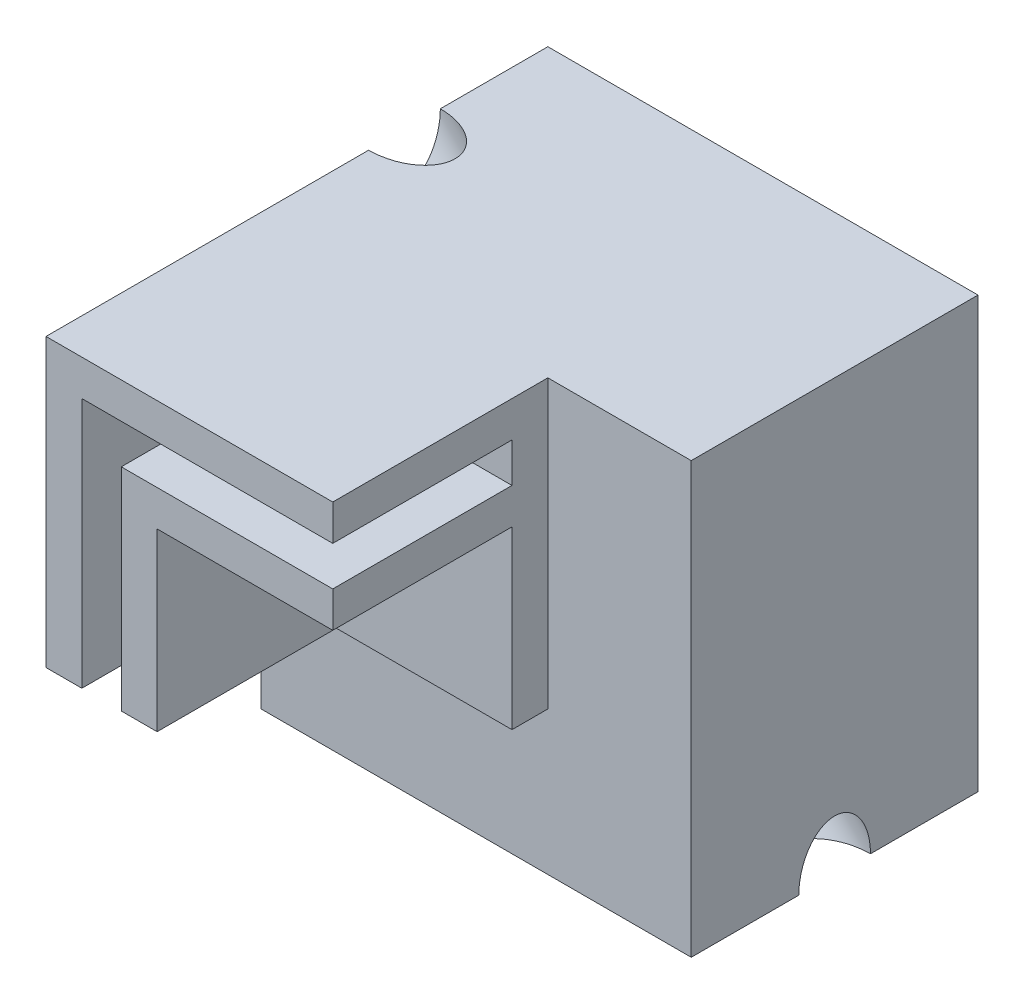
ISO-10303-21;
HEADER;
FILE_DESCRIPTION(('STEP AP214'),'2;1');
FILE_NAME('part.step','',(''),(''),'','','');
FILE_SCHEMA(('AUTOMOTIVE_DESIGN { 1 0 10303 214 1 1 1 1 }'));
ENDSEC;
DATA;
#1=APPLICATION_CONTEXT('core data for automotive mechanical design processes');
#2=APPLICATION_PROTOCOL_DEFINITION('international standard','automotive_design',2000,#1);
#3=PRODUCT_CONTEXT('',#1,'mechanical');
#4=PRODUCT('Part','Part','',(#3));
#5=PRODUCT_RELATED_PRODUCT_CATEGORY('part','',(#4));
#6=PRODUCT_DEFINITION_FORMATION('','',#4);
#7=PRODUCT_DEFINITION_CONTEXT('part definition',#1,'design');
#8=PRODUCT_DEFINITION('design','',#6,#7);
#9=PRODUCT_DEFINITION_SHAPE('','',#8);
#10=(LENGTH_UNIT() NAMED_UNIT(*) SI_UNIT(.MILLI.,.METRE.));
#11=(NAMED_UNIT(*) PLANE_ANGLE_UNIT() SI_UNIT($,.RADIAN.));
#12=(NAMED_UNIT(*) SI_UNIT($,.STERADIAN.) SOLID_ANGLE_UNIT());
#13=UNCERTAINTY_MEASURE_WITH_UNIT(LENGTH_MEASURE(1.E-05),#10,'distance_accuracy_value','');
#14=(GEOMETRIC_REPRESENTATION_CONTEXT(3) GLOBAL_UNCERTAINTY_ASSIGNED_CONTEXT((#13)) GLOBAL_UNIT_ASSIGNED_CONTEXT((#10,
#11,#12)) REPRESENTATION_CONTEXT('',''));
#15=CARTESIAN_POINT('',(0.,0.,0.));
#16=DIRECTION('',(0.,0.,1.));
#17=DIRECTION('',(1.,0.,0.));
#18=AXIS2_PLACEMENT_3D('',#15,#16,#17);
#19=CARTESIAN_POINT('',(0.,0.,30.));
#20=DIRECTION('',(0.,0.,1.));
#21=DIRECTION('',(1.,0.,0.));
#22=AXIS2_PLACEMENT_3D('',#19,#20,#21);
#23=PLANE('',#22);
#24=DIRECTION('',(0.,-1.,0.));
#25=VECTOR('',#24,1.);
#26=CARTESIAN_POINT('',(0.,-30.,30.));
#27=LINE('',#26,#25);
#28=CARTESIAN_POINT('',(0.,0.,30.));
#29=VERTEX_POINT('',#28);
#30=CARTESIAN_POINT('',(0.,-35.,30.));
#31=VERTEX_POINT('',#30);
#32=EDGE_CURVE('E245',#29,#31,#27,.T.);
#33=ORIENTED_EDGE('',*,*,#32,.F.);
#34=DIRECTION('',(-1.,0.,0.));
#35=VECTOR('',#34,1.);
#36=CARTESIAN_POINT('',(30.,0.,30.));
#37=LINE('',#36,#35);
#38=CARTESIAN_POINT('',(35.,0.,30.));
#39=VERTEX_POINT('',#38);
#40=EDGE_CURVE('E268',#39,#29,#37,.T.);
#41=ORIENTED_EDGE('',*,*,#40,.F.);
#42=DIRECTION('',(0.,-1.,0.));
#43=VECTOR('',#42,1.);
#44=CARTESIAN_POINT('',(35.,5.,30.));
#45=LINE('',#44,#43);
#46=CARTESIAN_POINT('',(35.,5.,30.));
#47=VERTEX_POINT('',#46);
#48=EDGE_CURVE('E313',#47,#39,#45,.T.);
#49=ORIENTED_EDGE('',*,*,#48,.F.);
#50=DIRECTION('',(1.,0.,0.));
#51=VECTOR('',#50,1.);
#52=CARTESIAN_POINT('',(-5.,5.,30.));
#53=LINE('',#52,#51);
#54=CARTESIAN_POINT('',(-5.,5.,30.));
#55=VERTEX_POINT('',#54);
#56=EDGE_CURVE('E317',#55,#47,#53,.T.);
#57=ORIENTED_EDGE('',*,*,#56,.F.);
#58=DIRECTION('',(0.,-1.,0.));
#59=VECTOR('',#58,1.);
#60=CARTESIAN_POINT('',(-5.,5.,30.));
#61=LINE('',#60,#59);
#62=CARTESIAN_POINT('',(-5.,-35.,30.));
#63=VERTEX_POINT('',#62);
#64=EDGE_CURVE('E294',#55,#63,#61,.T.);
#65=ORIENTED_EDGE('',*,*,#64,.T.);
#66=DIRECTION('',(1.,0.,0.));
#67=VECTOR('',#66,1.);
#68=CARTESIAN_POINT('',(-5.,-35.,30.));
#69=LINE('',#68,#67);
#70=EDGE_CURVE('E300',#63,#31,#69,.T.);
#71=ORIENTED_EDGE('',*,*,#70,.T.);
#72=EDGE_LOOP('',(#33,#41,#49,#57,#65,#71));
#73=FACE_BOUND('',#72,.T.);
#74=ADVANCED_FACE('F69',(#73),#23,.T.);
#75=CARTESIAN_POINT('',(-5.,5.,30.));
#76=DIRECTION('',(1.,0.,0.));
#77=DIRECTION('',(0.,0.,-1.));
#78=AXIS2_PLACEMENT_3D('',#75,#76,#77);
#79=PLANE('',#78);
#80=DIRECTION('',(0.,0.,-1.));
#81=VECTOR('',#80,1.);
#82=CARTESIAN_POINT('',(-5.,5.,30.));
#83=LINE('',#82,#81);
#84=CARTESIAN_POINT('',(-5.,5.,-15.));
#85=VERTEX_POINT('',#84);
#86=EDGE_CURVE('E327',#55,#85,#83,.T.);
#87=ORIENTED_EDGE('',*,*,#86,.T.);
#88=CARTESIAN_POINT('',(-5.,4.99999999999981,-20.));
#89=DIRECTION('',(1.,0.,0.));
#90=DIRECTION('',(0.,-1.,0.));
#91=AXIS2_PLACEMENT_3D('',#88,#89,#90);
#92=ELLIPSE('',#91,7.07106781186547,5.);
#93=CARTESIAN_POINT('',(-5.00000000000001,5.,-25.));
#94=VERTEX_POINT('',#93);
#95=EDGE_CURVE('E84',#85,#94,#92,.T.);
#96=ORIENTED_EDGE('',*,*,#95,.T.);
#97=CARTESIAN_POINT('',(-5.,5.,-40.));
#98=VERTEX_POINT('',#97);
#99=EDGE_CURVE('E321',#94,#98,#83,.T.);
#100=ORIENTED_EDGE('',*,*,#99,.T.);
#101=DIRECTION('',(0.,-1.,0.));
#102=VECTOR('',#101,1.);
#103=CARTESIAN_POINT('',(-5.,5.,-40.));
#104=LINE('',#103,#102);
#105=CARTESIAN_POINT('',(-5.00000000000001,-55.,-40.));
#106=VERTEX_POINT('',#105);
#107=EDGE_CURVE('E360',#98,#106,#104,.T.);
#108=ORIENTED_EDGE('',*,*,#107,.T.);
#109=DIRECTION('',(0.,0.,1.));
#110=VECTOR('',#109,1.);
#111=CARTESIAN_POINT('',(-5.00000000000001,-55.,-40.));
#112=LINE('',#111,#110);
#113=CARTESIAN_POINT('',(-5.00000000000001,-55.,0.));
#114=VERTEX_POINT('',#113);
#115=EDGE_CURVE('E211',#106,#114,#112,.T.);
#116=ORIENTED_EDGE('',*,*,#115,.T.);
#117=DIRECTION('',(0.,-1.,0.));
#118=VECTOR('',#117,1.);
#119=CARTESIAN_POINT('',(-5.,5.,0.));
#120=LINE('',#119,#118);
#121=CARTESIAN_POINT('',(-5.,-35.,0.));
#122=VERTEX_POINT('',#121);
#123=EDGE_CURVE('E216',#122,#114,#120,.T.);
#124=ORIENTED_EDGE('',*,*,#123,.F.);
#125=DIRECTION('',(0.,0.,-1.));
#126=VECTOR('',#125,1.);
#127=CARTESIAN_POINT('',(-5.,-35.,30.));
#128=LINE('',#127,#126);
#129=EDGE_CURVE('E78',#63,#122,#128,.T.);
#130=ORIENTED_EDGE('',*,*,#129,.F.);
#131=ORIENTED_EDGE('',*,*,#64,.F.);
#132=EDGE_LOOP('',(#87,#96,#100,#108,#116,#124,#130,#131));
#133=FACE_BOUND('',#132,.T.);
#134=ADVANCED_FACE('F71',(#133),#79,.F.);
#135=CARTESIAN_POINT('',(-5.,-35.,30.));
#136=DIRECTION('',(0.,1.,0.));
#137=DIRECTION('',(0.,0.,1.));
#138=AXIS2_PLACEMENT_3D('',#135,#136,#137);
#139=PLANE('',#138);
#140=DIRECTION('',(1.,0.,0.));
#141=VECTOR('',#140,1.);
#142=CARTESIAN_POINT('',(0.,-35.,5.));
#143=LINE('',#142,#141);
#144=CARTESIAN_POINT('',(0.,-35.,5.));
#145=VERTEX_POINT('',#144);
#146=CARTESIAN_POINT('',(5.5,-35.,5.));
#147=VERTEX_POINT('',#146);
#148=EDGE_CURVE('E240',#145,#147,#143,.T.);
#149=ORIENTED_EDGE('',*,*,#148,.F.);
#150=DIRECTION('',(0.,0.,1.));
#151=VECTOR('',#150,1.);
#152=CARTESIAN_POINT('',(0.,-35.,5.));
#153=LINE('',#152,#151);
#154=EDGE_CURVE('E274',#145,#31,#153,.T.);
#155=ORIENTED_EDGE('',*,*,#154,.T.);
#156=ORIENTED_EDGE('',*,*,#70,.F.);
#157=ORIENTED_EDGE('',*,*,#129,.T.);
#158=DIRECTION('',(1.,0.,0.));
#159=VECTOR('',#158,1.);
#160=CARTESIAN_POINT('',(-5.,-35.,0.));
#161=LINE('',#160,#159);
#162=CARTESIAN_POINT('',(35.,-35.,0.));
#163=VERTEX_POINT('',#162);
#164=EDGE_CURVE('E278',#122,#163,#161,.T.);
#165=ORIENTED_EDGE('',*,*,#164,.T.);
#166=DIRECTION('',(0.,0.,-1.));
#167=VECTOR('',#166,1.);
#168=CARTESIAN_POINT('',(35.,-35.,39.6482322781408));
#169=LINE('',#168,#167);
#170=CARTESIAN_POINT('',(35.,-35.,5.));
#171=VERTEX_POINT('',#170);
#172=EDGE_CURVE('E230',#171,#163,#169,.T.);
#173=ORIENTED_EDGE('',*,*,#172,.F.);
#174=DIRECTION('',(-1.,0.,0.));
#175=VECTOR('',#174,1.);
#176=CARTESIAN_POINT('',(35.,-35.,5.));
#177=LINE('',#176,#175);
#178=CARTESIAN_POINT('',(10.5,-35.,5.));
#179=VERTEX_POINT('',#178);
#180=EDGE_CURVE('E220',#171,#179,#177,.T.);
#181=ORIENTED_EDGE('',*,*,#180,.T.);
#182=DIRECTION('',(0.,0.,-1.));
#183=VECTOR('',#182,1.);
#184=CARTESIAN_POINT('',(10.5,-35.,30.));
#185=LINE('',#184,#183);
#186=CARTESIAN_POINT('',(10.5,-35.,30.));
#187=VERTEX_POINT('',#186);
#188=EDGE_CURVE('E343',#187,#179,#185,.T.);
#189=ORIENTED_EDGE('',*,*,#188,.F.);
#190=CARTESIAN_POINT('',(5.5,-35.,30.));
#191=VERTEX_POINT('',#190);
#192=EDGE_CURVE('E298',#191,#187,#69,.T.);
#193=ORIENTED_EDGE('',*,*,#192,.F.);
#194=DIRECTION('',(0.,0.,1.));
#195=VECTOR('',#194,1.);
#196=CARTESIAN_POINT('',(5.5,-35.,5.));
#197=LINE('',#196,#195);
#198=EDGE_CURVE('E261',#147,#191,#197,.T.);
#199=ORIENTED_EDGE('',*,*,#198,.F.);
#200=EDGE_LOOP('',(#149,#155,#156,#157,#165,#173,#181,#189,#193,#199));
#201=FACE_BOUND('',#200,.T.);
#202=ADVANCED_FACE('F350',(#201),#139,.F.);
#203=CARTESIAN_POINT('',(10.5,-10.5,30.));
#204=DIRECTION('',(1.,0.,0.));
#205=DIRECTION('',(0.,0.,-1.));
#206=AXIS2_PLACEMENT_3D('',#203,#204,#205);
#207=PLANE('',#206);
#208=DIRECTION('',(0.,1.,0.));
#209=VECTOR('',#208,1.);
#210=CARTESIAN_POINT('',(10.5,-10.5,5.));
#211=LINE('',#210,#209);
#212=CARTESIAN_POINT('',(10.5,-10.5,5.));
#213=VERTEX_POINT('',#212);
#214=EDGE_CURVE('E224',#179,#213,#211,.T.);
#215=ORIENTED_EDGE('',*,*,#214,.T.);
#216=DIRECTION('',(0.,0.,-1.));
#217=VECTOR('',#216,1.);
#218=CARTESIAN_POINT('',(10.5,-10.5,30.));
#219=LINE('',#218,#217);
#220=CARTESIAN_POINT('',(10.5,-10.5,30.));
#221=VERTEX_POINT('',#220);
#222=EDGE_CURVE('E339',#221,#213,#219,.T.);
#223=ORIENTED_EDGE('',*,*,#222,.F.);
#224=DIRECTION('',(0.,-1.,0.));
#225=VECTOR('',#224,1.);
#226=CARTESIAN_POINT('',(10.5,-10.5,30.));
#227=LINE('',#226,#225);
#228=EDGE_CURVE('E304',#221,#187,#227,.T.);
#229=ORIENTED_EDGE('',*,*,#228,.T.);
#230=ORIENTED_EDGE('',*,*,#188,.T.);
#231=EDGE_LOOP('',(#215,#223,#229,#230));
#232=FACE_BOUND('',#231,.T.);
#233=ADVANCED_FACE('F407',(#232),#207,.T.);
#234=CARTESIAN_POINT('',(10.5,-10.5,30.));
#235=DIRECTION('',(0.,1.,0.));
#236=DIRECTION('',(0.,0.,1.));
#237=AXIS2_PLACEMENT_3D('',#234,#235,#236);
#238=PLANE('',#237);
#239=ORIENTED_EDGE('',*,*,#222,.T.);
#240=DIRECTION('',(1.,0.,0.));
#241=VECTOR('',#240,1.);
#242=CARTESIAN_POINT('',(35.,-10.5,5.));
#243=LINE('',#242,#241);
#244=CARTESIAN_POINT('',(35.,-10.5,5.));
#245=VERTEX_POINT('',#244);
#246=EDGE_CURVE('E231',#213,#245,#243,.T.);
#247=ORIENTED_EDGE('',*,*,#246,.T.);
#248=DIRECTION('',(0.,0.,-1.));
#249=VECTOR('',#248,1.);
#250=CARTESIAN_POINT('',(35.,-10.5,30.));
#251=LINE('',#250,#249);
#252=CARTESIAN_POINT('',(35.,-10.5,30.));
#253=VERTEX_POINT('',#252);
#254=EDGE_CURVE('E335',#253,#245,#251,.T.);
#255=ORIENTED_EDGE('',*,*,#254,.F.);
#256=DIRECTION('',(1.,0.,0.));
#257=VECTOR('',#256,1.);
#258=CARTESIAN_POINT('',(10.5,-10.5,30.));
#259=LINE('',#258,#257);
#260=EDGE_CURVE('E308',#221,#253,#259,.T.);
#261=ORIENTED_EDGE('',*,*,#260,.F.);
#262=EDGE_LOOP('',(#239,#247,#255,#261));
#263=FACE_BOUND('',#262,.T.);
#264=ADVANCED_FACE('F410',(#263),#238,.F.);
#265=CARTESIAN_POINT('',(35.,5.,30.));
#266=DIRECTION('',(1.,0.,0.));
#267=DIRECTION('',(0.,0.,-1.));
#268=AXIS2_PLACEMENT_3D('',#265,#266,#267);
#269=PLANE('',#268);
#270=DIRECTION('',(0.,0.,1.));
#271=VECTOR('',#270,1.);
#272=CARTESIAN_POINT('',(35.,0.,5.));
#273=LINE('',#272,#271);
#274=CARTESIAN_POINT('',(35.,0.,5.));
#275=VERTEX_POINT('',#274);
#276=EDGE_CURVE('E282',#275,#39,#273,.T.);
#277=ORIENTED_EDGE('',*,*,#276,.F.);
#278=DIRECTION('',(0.,1.,0.));
#279=VECTOR('',#278,1.);
#280=CARTESIAN_POINT('',(35.,0.,5.));
#281=LINE('',#280,#279);
#282=CARTESIAN_POINT('',(35.,-5.5,5.));
#283=VERTEX_POINT('',#282);
#284=EDGE_CURVE('E251',#283,#275,#281,.T.);
#285=ORIENTED_EDGE('',*,*,#284,.F.);
#286=DIRECTION('',(0.,0.,1.));
#287=VECTOR('',#286,1.);
#288=CARTESIAN_POINT('',(35.,-5.5,5.));
#289=LINE('',#288,#287);
#290=CARTESIAN_POINT('',(35.,-5.5,30.));
#291=VERTEX_POINT('',#290);
#292=EDGE_CURVE('E285',#283,#291,#289,.T.);
#293=ORIENTED_EDGE('',*,*,#292,.T.);
#294=EDGE_CURVE('E312',#291,#253,#45,.T.);
#295=ORIENTED_EDGE('',*,*,#294,.T.);
#296=ORIENTED_EDGE('',*,*,#254,.T.);
#297=DIRECTION('',(0.,-1.,0.));
#298=VECTOR('',#297,1.);
#299=CARTESIAN_POINT('',(35.,-10.5,5.));
#300=LINE('',#299,#298);
#301=EDGE_CURVE('E226',#245,#171,#300,.T.);
#302=ORIENTED_EDGE('',*,*,#301,.T.);
#303=ORIENTED_EDGE('',*,*,#172,.T.);
#304=DIRECTION('',(0.,-1.,0.));
#305=VECTOR('',#304,1.);
#306=CARTESIAN_POINT('',(35.,5.,0.));
#307=LINE('',#306,#305);
#308=CARTESIAN_POINT('',(35.,5.,0.));
#309=VERTEX_POINT('',#308);
#310=EDGE_CURVE('E299',#309,#163,#307,.T.);
#311=ORIENTED_EDGE('',*,*,#310,.F.);
#312=DIRECTION('',(0.,0.,-1.));
#313=VECTOR('',#312,1.);
#314=CARTESIAN_POINT('',(35.,5.,30.));
#315=LINE('',#314,#313);
#316=EDGE_CURVE('E331',#47,#309,#315,.T.);
#317=ORIENTED_EDGE('',*,*,#316,.F.);
#318=ORIENTED_EDGE('',*,*,#48,.T.);
#319=EDGE_LOOP('',(#277,#285,#293,#295,#296,#302,#303,#311,#317,#318));
#320=FACE_BOUND('',#319,.T.);
#321=ADVANCED_FACE('F398',(#320),#269,.T.);
#322=CARTESIAN_POINT('',(-5.,5.,30.));
#323=DIRECTION('',(0.,1.,0.));
#324=DIRECTION('',(0.,0.,1.));
#325=AXIS2_PLACEMENT_3D('',#322,#323,#324);
#326=PLANE('',#325);
#327=CARTESIAN_POINT('',(-5.00000000000019,5.,-20.));
#328=DIRECTION('',(0.,1.,0.));
#329=DIRECTION('',(1.,0.,0.));
#330=AXIS2_PLACEMENT_3D('',#327,#328,#329);
#331=ELLIPSE('',#330,7.07106781186549,5.);
#332=EDGE_CURVE('E204',#85,#94,#331,.T.);
#333=ORIENTED_EDGE('',*,*,#332,.F.);
#334=ORIENTED_EDGE('',*,*,#86,.F.);
#335=ORIENTED_EDGE('',*,*,#56,.T.);
#336=ORIENTED_EDGE('',*,*,#316,.T.);
#337=DIRECTION('',(1.,0.,0.));
#338=VECTOR('',#337,1.);
#339=CARTESIAN_POINT('',(35.,5.,0.));
#340=LINE('',#339,#338);
#341=CARTESIAN_POINT('',(55.,4.99999999999999,0.));
#342=VERTEX_POINT('',#341);
#343=EDGE_CURVE('E381',#309,#342,#340,.T.);
#344=ORIENTED_EDGE('',*,*,#343,.T.);
#345=DIRECTION('',(0.,0.,1.));
#346=VECTOR('',#345,1.);
#347=CARTESIAN_POINT('',(55.,4.99999999999999,-40.));
#348=LINE('',#347,#346);
#349=CARTESIAN_POINT('',(55.,4.99999999999999,-40.));
#350=VERTEX_POINT('',#349);
#351=EDGE_CURVE('E225',#350,#342,#348,.T.);
#352=ORIENTED_EDGE('',*,*,#351,.F.);
#353=DIRECTION('',(1.,0.,0.));
#354=VECTOR('',#353,1.);
#355=CARTESIAN_POINT('',(35.,5.,-40.));
#356=LINE('',#355,#354);
#357=EDGE_CURVE('E380',#98,#350,#356,.T.);
#358=ORIENTED_EDGE('',*,*,#357,.F.);
#359=ORIENTED_EDGE('',*,*,#99,.F.);
#360=EDGE_LOOP('',(#333,#334,#335,#336,#344,#352,#358,#359));
#361=FACE_BOUND('',#360,.T.);
#362=ADVANCED_FACE('F394',(#361),#326,.T.);
#363=DIRECTION('',(1.,0.,0.));
#364=VECTOR('',#363,1.);
#365=CARTESIAN_POINT('',(35.,-5.5,30.));
#366=LINE('',#365,#364);
#367=CARTESIAN_POINT('',(5.5,-5.5,30.));
#368=VERTEX_POINT('',#367);
#369=EDGE_CURVE('E265',#368,#291,#366,.T.);
#370=ORIENTED_EDGE('',*,*,#369,.F.);
#371=DIRECTION('',(0.,1.,0.));
#372=VECTOR('',#371,1.);
#373=CARTESIAN_POINT('',(5.5,-30.,30.));
#374=LINE('',#373,#372);
#375=EDGE_CURVE('E239',#191,#368,#374,.T.);
#376=ORIENTED_EDGE('',*,*,#375,.F.);
#377=ORIENTED_EDGE('',*,*,#192,.T.);
#378=ORIENTED_EDGE('',*,*,#228,.F.);
#379=ORIENTED_EDGE('',*,*,#260,.T.);
#380=ORIENTED_EDGE('',*,*,#294,.F.);
#381=EDGE_LOOP('',(#370,#376,#377,#378,#379,#380));
#382=FACE_BOUND('',#381,.T.);
#383=ADVANCED_FACE('F416',(#382),#23,.T.);
#384=CARTESIAN_POINT('',(0.,-30.,5.));
#385=DIRECTION('',(-1.,0.,0.));
#386=DIRECTION('',(0.,0.,1.));
#387=AXIS2_PLACEMENT_3D('',#384,#385,#386);
#388=PLANE('',#387);
#389=ORIENTED_EDGE('',*,*,#32,.T.);
#390=ORIENTED_EDGE('',*,*,#154,.F.);
#391=DIRECTION('',(0.,-1.,0.));
#392=VECTOR('',#391,1.);
#393=CARTESIAN_POINT('',(0.,0.,5.));
#394=LINE('',#393,#392);
#395=CARTESIAN_POINT('',(0.,0.,5.));
#396=VERTEX_POINT('',#395);
#397=EDGE_CURVE('E258',#396,#145,#394,.T.);
#398=ORIENTED_EDGE('',*,*,#397,.F.);
#399=DIRECTION('',(0.,0.,1.));
#400=VECTOR('',#399,1.);
#401=CARTESIAN_POINT('',(0.,0.,5.));
#402=LINE('',#401,#400);
#403=EDGE_CURVE('E279',#396,#29,#402,.T.);
#404=ORIENTED_EDGE('',*,*,#403,.T.);
#405=EDGE_LOOP('',(#389,#390,#398,#404));
#406=FACE_BOUND('',#405,.T.);
#407=ADVANCED_FACE('F446',(#406),#388,.F.);
#408=CARTESIAN_POINT('',(30.,0.,5.));
#409=DIRECTION('',(0.,1.,0.));
#410=DIRECTION('',(0.,0.,1.));
#411=AXIS2_PLACEMENT_3D('',#408,#409,#410);
#412=PLANE('',#411);
#413=ORIENTED_EDGE('',*,*,#40,.T.);
#414=ORIENTED_EDGE('',*,*,#403,.F.);
#415=DIRECTION('',(-1.,0.,0.));
#416=VECTOR('',#415,1.);
#417=CARTESIAN_POINT('',(30.,0.,5.));
#418=LINE('',#417,#416);
#419=EDGE_CURVE('E255',#275,#396,#418,.T.);
#420=ORIENTED_EDGE('',*,*,#419,.F.);
#421=ORIENTED_EDGE('',*,*,#276,.T.);
#422=EDGE_LOOP('',(#413,#414,#420,#421));
#423=FACE_BOUND('',#422,.T.);
#424=ADVANCED_FACE('F450',(#423),#412,.F.);
#425=CARTESIAN_POINT('',(35.,-5.5,5.));
#426=DIRECTION('',(0.,-1.,0.));
#427=DIRECTION('',(0.,0.,-1.));
#428=AXIS2_PLACEMENT_3D('',#425,#426,#427);
#429=PLANE('',#428);
#430=ORIENTED_EDGE('',*,*,#369,.T.);
#431=ORIENTED_EDGE('',*,*,#292,.F.);
#432=DIRECTION('',(1.,0.,0.));
#433=VECTOR('',#432,1.);
#434=CARTESIAN_POINT('',(5.5,-5.5,5.));
#435=LINE('',#434,#433);
#436=CARTESIAN_POINT('',(5.5,-5.5,5.));
#437=VERTEX_POINT('',#436);
#438=EDGE_CURVE('E248',#437,#283,#435,.T.);
#439=ORIENTED_EDGE('',*,*,#438,.F.);
#440=DIRECTION('',(0.,0.,1.));
#441=VECTOR('',#440,1.);
#442=CARTESIAN_POINT('',(5.5,-5.5,5.));
#443=LINE('',#442,#441);
#444=EDGE_CURVE('E289',#437,#368,#443,.T.);
#445=ORIENTED_EDGE('',*,*,#444,.T.);
#446=EDGE_LOOP('',(#430,#431,#439,#445));
#447=FACE_BOUND('',#446,.T.);
#448=ADVANCED_FACE('F542',(#447),#429,.F.);
#449=CARTESIAN_POINT('',(5.5,-30.,5.));
#450=DIRECTION('',(1.,0.,0.));
#451=DIRECTION('',(0.,0.,-1.));
#452=AXIS2_PLACEMENT_3D('',#449,#450,#451);
#453=PLANE('',#452);
#454=ORIENTED_EDGE('',*,*,#375,.T.);
#455=ORIENTED_EDGE('',*,*,#444,.F.);
#456=DIRECTION('',(0.,1.,0.));
#457=VECTOR('',#456,1.);
#458=CARTESIAN_POINT('',(5.5,-35.,5.));
#459=LINE('',#458,#457);
#460=EDGE_CURVE('E244',#147,#437,#459,.T.);
#461=ORIENTED_EDGE('',*,*,#460,.F.);
#462=ORIENTED_EDGE('',*,*,#198,.T.);
#463=EDGE_LOOP('',(#454,#455,#461,#462));
#464=FACE_BOUND('',#463,.T.);
#465=ADVANCED_FACE('F532',(#464),#453,.F.);
#466=CARTESIAN_POINT('',(0.,0.,5.));
#467=DIRECTION('',(0.,0.,1.));
#468=DIRECTION('',(1.,0.,0.));
#469=AXIS2_PLACEMENT_3D('',#466,#467,#468);
#470=PLANE('',#469);
#471=ORIENTED_EDGE('',*,*,#148,.T.);
#472=ORIENTED_EDGE('',*,*,#460,.T.);
#473=ORIENTED_EDGE('',*,*,#438,.T.);
#474=ORIENTED_EDGE('',*,*,#284,.T.);
#475=ORIENTED_EDGE('',*,*,#419,.T.);
#476=ORIENTED_EDGE('',*,*,#397,.T.);
#477=EDGE_LOOP('',(#471,#472,#473,#474,#475,#476));
#478=FACE_BOUND('',#477,.T.);
#479=ADVANCED_FACE('F524',(#478),#470,.T.);
#480=CARTESIAN_POINT('',(0.,0.,5.));
#481=DIRECTION('',(0.,0.,1.));
#482=DIRECTION('',(1.,0.,0.));
#483=AXIS2_PLACEMENT_3D('',#480,#481,#482);
#484=PLANE('',#483);
#485=ORIENTED_EDGE('',*,*,#301,.F.);
#486=ORIENTED_EDGE('',*,*,#246,.F.);
#487=ORIENTED_EDGE('',*,*,#214,.F.);
#488=ORIENTED_EDGE('',*,*,#180,.F.);
#489=EDGE_LOOP('',(#485,#486,#487,#488));
#490=FACE_BOUND('',#489,.T.);
#491=ADVANCED_FACE('F404',(#490),#484,.T.);
#492=CARTESIAN_POINT('',(0.,0.,0.));
#493=DIRECTION('',(0.,0.,-1.));
#494=DIRECTION('',(-1.,0.,0.));
#495=AXIS2_PLACEMENT_3D('',#492,#493,#494);
#496=PLANE('',#495);
#497=ORIENTED_EDGE('',*,*,#343,.F.);
#498=ORIENTED_EDGE('',*,*,#310,.T.);
#499=ORIENTED_EDGE('',*,*,#164,.F.);
#500=ORIENTED_EDGE('',*,*,#123,.T.);
#501=DIRECTION('',(1.,0.,0.));
#502=VECTOR('',#501,1.);
#503=CARTESIAN_POINT('',(-5.00000000000001,-55.,0.));
#504=LINE('',#503,#502);
#505=CARTESIAN_POINT('',(55.,-55.,0.));
#506=VERTEX_POINT('',#505);
#507=EDGE_CURVE('E368',#114,#506,#504,.T.);
#508=ORIENTED_EDGE('',*,*,#507,.T.);
#509=DIRECTION('',(0.,-1.,0.));
#510=VECTOR('',#509,1.);
#511=CARTESIAN_POINT('',(55.,4.99999999999999,0.));
#512=LINE('',#511,#510);
#513=EDGE_CURVE('E363',#342,#506,#512,.T.);
#514=ORIENTED_EDGE('',*,*,#513,.F.);
#515=EDGE_LOOP('',(#497,#498,#499,#500,#508,#514));
#516=FACE_BOUND('',#515,.T.);
#517=ADVANCED_FACE('F392',(#516),#496,.F.);
#518=CARTESIAN_POINT('',(55.,4.99999999999999,-40.));
#519=DIRECTION('',(-1.,0.,0.));
#520=DIRECTION('',(0.,-1.,0.));
#521=AXIS2_PLACEMENT_3D('',#518,#519,#520);
#522=PLANE('',#521);
#523=DIRECTION('',(0.,0.,1.));
#524=VECTOR('',#523,1.);
#525=CARTESIAN_POINT('',(55.,-55.,-40.));
#526=LINE('',#525,#524);
#527=CARTESIAN_POINT('',(55.,-55.,-15.));
#528=VERTEX_POINT('',#527);
#529=EDGE_CURVE('E202',#528,#506,#526,.T.);
#530=ORIENTED_EDGE('',*,*,#529,.F.);
#531=CARTESIAN_POINT('',(55.,-55.,-20.));
#532=DIRECTION('',(-1.,0.,0.));
#533=DIRECTION('',(0.,-1.,0.));
#534=AXIS2_PLACEMENT_3D('',#531,#532,#533);
#535=ELLIPSE('',#534,7.07106781186546,5.);
#536=CARTESIAN_POINT('',(55.,-55.,-25.));
#537=VERTEX_POINT('',#536);
#538=EDGE_CURVE('E90',#528,#537,#535,.T.);
#539=ORIENTED_EDGE('',*,*,#538,.T.);
#540=CARTESIAN_POINT('',(55.,-55.,-40.));
#541=VERTEX_POINT('',#540);
#542=EDGE_CURVE('E199',#541,#537,#526,.T.);
#543=ORIENTED_EDGE('',*,*,#542,.F.);
#544=DIRECTION('',(0.,-1.,0.));
#545=VECTOR('',#544,1.);
#546=CARTESIAN_POINT('',(55.,4.99999999999999,-40.));
#547=LINE('',#546,#545);
#548=EDGE_CURVE('E377',#350,#541,#547,.T.);
#549=ORIENTED_EDGE('',*,*,#548,.F.);
#550=ORIENTED_EDGE('',*,*,#351,.T.);
#551=ORIENTED_EDGE('',*,*,#513,.T.);
#552=EDGE_LOOP('',(#530,#539,#543,#549,#550,#551));
#553=FACE_BOUND('',#552,.T.);
#554=ADVANCED_FACE('F197',(#553),#522,.F.);
#555=CARTESIAN_POINT('',(0.,0.,-40.));
#556=DIRECTION('',(0.,0.,-1.));
#557=DIRECTION('',(-1.,0.,0.));
#558=AXIS2_PLACEMENT_3D('',#555,#556,#557);
#559=PLANE('',#558);
#560=ORIENTED_EDGE('',*,*,#548,.T.);
#561=DIRECTION('',(1.,0.,0.));
#562=VECTOR('',#561,1.);
#563=CARTESIAN_POINT('',(-5.00000000000001,-55.,-40.));
#564=LINE('',#563,#562);
#565=EDGE_CURVE('E209',#106,#541,#564,.T.);
#566=ORIENTED_EDGE('',*,*,#565,.F.);
#567=ORIENTED_EDGE('',*,*,#107,.F.);
#568=ORIENTED_EDGE('',*,*,#357,.T.);
#569=EDGE_LOOP('',(#560,#566,#567,#568));
#570=FACE_BOUND('',#569,.T.);
#571=ADVANCED_FACE('F424',(#570),#559,.T.);
#572=CARTESIAN_POINT('',(-5.00000000000001,-55.,-40.));
#573=DIRECTION('',(0.,-1.,0.));
#574=DIRECTION('',(1.,0.,0.));
#575=AXIS2_PLACEMENT_3D('',#572,#573,#574);
#576=PLANE('',#575);
#577=CARTESIAN_POINT('',(55.,-55.,-20.));
#578=DIRECTION('',(0.,-1.,0.));
#579=DIRECTION('',(1.,0.,0.));
#580=AXIS2_PLACEMENT_3D('',#577,#578,#579);
#581=ELLIPSE('',#580,7.07106781186549,5.);
#582=EDGE_CURVE('E12',#528,#537,#581,.T.);
#583=ORIENTED_EDGE('',*,*,#582,.F.);
#584=ORIENTED_EDGE('',*,*,#529,.T.);
#585=ORIENTED_EDGE('',*,*,#507,.F.);
#586=ORIENTED_EDGE('',*,*,#115,.F.);
#587=ORIENTED_EDGE('',*,*,#565,.T.);
#588=ORIENTED_EDGE('',*,*,#542,.T.);
#589=EDGE_LOOP('',(#583,#584,#585,#586,#587,#588));
#590=FACE_BOUND('',#589,.T.);
#591=ADVANCED_FACE('F206',(#590),#576,.T.);
#592=CARTESIAN_POINT('',(-5.0000000000001,4.99999999999991,-20.));
#593=DIRECTION('',(0.707106781186549,-0.707106781186546,0.));
#594=DIRECTION('',(0.707106781186546,0.707106781186549,0.));
#595=AXIS2_PLACEMENT_3D('',#592,#593,#594);
#596=CYLINDRICAL_SURFACE('',#595,5.);
#597=ORIENTED_EDGE('',*,*,#582,.T.);
#598=ORIENTED_EDGE('',*,*,#538,.F.);
#599=EDGE_LOOP('',(#597,#598));
#600=FACE_BOUND('',#599,.T.);
#601=ORIENTED_EDGE('',*,*,#332,.T.);
#602=ORIENTED_EDGE('',*,*,#95,.F.);
#603=EDGE_LOOP('',(#601,#602));
#604=FACE_BOUND('',#603,.T.);
#605=ADVANCED_FACE('F191',(#600,#604),#596,.F.);
#606=CLOSED_SHELL('',(#74,#134,#202,#233,#264,#321,#362,#383,#407,#424,#448,#465,#479,#491,#517,
#554,#571,#591,#605));
#607=MANIFOLD_SOLID_BREP('B2',#606);
#608=ADVANCED_BREP_SHAPE_REPRESENTATION('',(#18,#607),#14);
#609=SHAPE_DEFINITION_REPRESENTATION(#9,#608);
ENDSEC;
END-ISO-10303-21;
